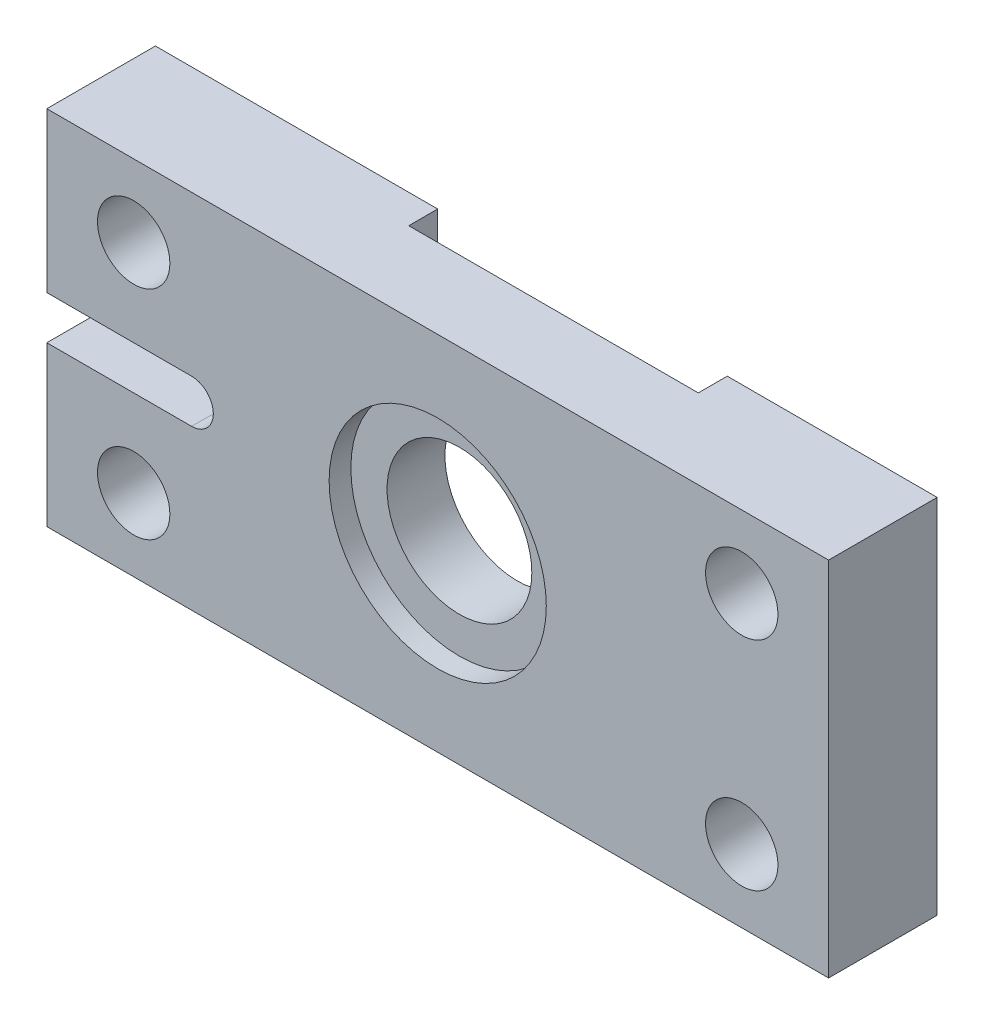
ISO-10303-21;
HEADER;
FILE_DESCRIPTION(('STEP AP214'),'2;1');
FILE_NAME('part.step','',(''),(''),'','','');
FILE_SCHEMA(('AUTOMOTIVE_DESIGN { 1 0 10303 214 1 1 1 1 }'));
ENDSEC;
DATA;
#1=APPLICATION_CONTEXT('core data for automotive mechanical design processes');
#2=APPLICATION_PROTOCOL_DEFINITION('international standard','automotive_design',2000,#1);
#3=PRODUCT_CONTEXT('',#1,'mechanical');
#4=PRODUCT('Part','Part','',(#3));
#5=PRODUCT_RELATED_PRODUCT_CATEGORY('part','',(#4));
#6=PRODUCT_DEFINITION_FORMATION('','',#4);
#7=PRODUCT_DEFINITION_CONTEXT('part definition',#1,'design');
#8=PRODUCT_DEFINITION('design','',#6,#7);
#9=PRODUCT_DEFINITION_SHAPE('','',#8);
#10=(LENGTH_UNIT() NAMED_UNIT(*) SI_UNIT(.MILLI.,.METRE.));
#11=(NAMED_UNIT(*) PLANE_ANGLE_UNIT() SI_UNIT($,.RADIAN.));
#12=(NAMED_UNIT(*) SI_UNIT($,.STERADIAN.) SOLID_ANGLE_UNIT());
#13=UNCERTAINTY_MEASURE_WITH_UNIT(LENGTH_MEASURE(1.E-05),#10,'distance_accuracy_value','');
#14=(GEOMETRIC_REPRESENTATION_CONTEXT(3) GLOBAL_UNCERTAINTY_ASSIGNED_CONTEXT((#13)) GLOBAL_UNIT_ASSIGNED_CONTEXT((#10,
#11,#12)) REPRESENTATION_CONTEXT('',''));
#15=CARTESIAN_POINT('',(0.,0.,0.));
#16=DIRECTION('',(0.,0.,1.));
#17=DIRECTION('',(1.,0.,0.));
#18=AXIS2_PLACEMENT_3D('',#15,#16,#17);
#19=CARTESIAN_POINT('',(0.,0.,0.));
#20=DIRECTION('',(0.,0.,1.));
#21=DIRECTION('',(1.,0.,0.));
#22=AXIS2_PLACEMENT_3D('',#19,#20,#21);
#23=PLANE('',#22);
#24=CARTESIAN_POINT('',(42.,15.,0.));
#25=DIRECTION('',(0.,0.,1.));
#26=DIRECTION('',(1.,0.,0.));
#27=AXIS2_PLACEMENT_3D('',#24,#25,#26);
#28=CIRCLE('',#27,5.);
#29=CARTESIAN_POINT('',(47.,15.,0.));
#30=VERTEX_POINT('',#29);
#31=EDGE_CURVE('E202',#30,#30,#28,.T.);
#32=ORIENTED_EDGE('',*,*,#31,.T.);
#33=EDGE_LOOP('',(#32));
#34=FACE_BOUND('',#33,.T.);
#35=CARTESIAN_POINT('',(42.,-15.,0.));
#36=DIRECTION('',(0.,0.,1.));
#37=DIRECTION('',(1.,0.,0.));
#38=AXIS2_PLACEMENT_3D('',#35,#36,#37);
#39=CIRCLE('',#38,5.);
#40=CARTESIAN_POINT('',(47.,-15.,0.));
#41=VERTEX_POINT('',#40);
#42=EDGE_CURVE('E193',#41,#41,#39,.T.);
#43=ORIENTED_EDGE('',*,*,#42,.T.);
#44=EDGE_LOOP('',(#43));
#45=FACE_BOUND('',#44,.T.);
#46=DIRECTION('',(1.,0.,0.));
#47=VECTOR('',#46,1.);
#48=CARTESIAN_POINT('',(-54.,-25.,0.));
#49=LINE('',#48,#47);
#50=CARTESIAN_POINT('',(25.,-25.,0.));
#51=VERTEX_POINT('',#50);
#52=CARTESIAN_POINT('',(54.,-25.,0.));
#53=VERTEX_POINT('',#52);
#54=EDGE_CURVE('E282',#51,#53,#49,.T.);
#55=ORIENTED_EDGE('',*,*,#54,.F.);
#56=DIRECTION('',(0.,-1.,0.));
#57=VECTOR('',#56,1.);
#58=CARTESIAN_POINT('',(25.,25.,0.));
#59=LINE('',#58,#57);
#60=CARTESIAN_POINT('',(25.,25.,0.));
#61=VERTEX_POINT('',#60);
#62=EDGE_CURVE('E169',#61,#51,#59,.T.);
#63=ORIENTED_EDGE('',*,*,#62,.F.);
#64=DIRECTION('',(-1.,0.,0.));
#65=VECTOR('',#64,1.);
#66=CARTESIAN_POINT('',(-54.,25.,0.));
#67=LINE('',#66,#65);
#68=CARTESIAN_POINT('',(54.,25.,0.));
#69=VERTEX_POINT('',#68);
#70=EDGE_CURVE('E156',#69,#61,#67,.T.);
#71=ORIENTED_EDGE('',*,*,#70,.F.);
#72=DIRECTION('',(0.,1.,0.));
#73=VECTOR('',#72,1.);
#74=CARTESIAN_POINT('',(54.,25.,0.));
#75=LINE('',#74,#73);
#76=EDGE_CURVE('E247',#53,#69,#75,.T.);
#77=ORIENTED_EDGE('',*,*,#76,.F.);
#78=EDGE_LOOP('',(#55,#63,#71,#77));
#79=FACE_BOUND('',#78,.T.);
#80=ADVANCED_FACE('F39',(#34,#45,#79),#23,.F.);
#81=CARTESIAN_POINT('',(0.,0.,15.));
#82=DIRECTION('',(0.,0.,-1.));
#83=DIRECTION('',(-1.,0.,0.));
#84=AXIS2_PLACEMENT_3D('',#81,#82,#83);
#85=CYLINDRICAL_SURFACE('',#84,10.);
#86=CARTESIAN_POINT('',(0.,0.,4.));
#87=DIRECTION('',(0.,0.,1.));
#88=DIRECTION('',(1.,0.,0.));
#89=AXIS2_PLACEMENT_3D('',#86,#87,#88);
#90=CIRCLE('',#89,10.);
#91=CARTESIAN_POINT('',(10.,0.,4.));
#92=VERTEX_POINT('',#91);
#93=EDGE_CURVE('E172',#92,#92,#90,.T.);
#94=ORIENTED_EDGE('',*,*,#93,.F.);
#95=EDGE_LOOP('',(#94));
#96=FACE_BOUND('',#95,.T.);
#97=CARTESIAN_POINT('',(0.,0.,12.));
#98=DIRECTION('',(0.,0.,1.));
#99=DIRECTION('',(1.,0.,0.));
#100=AXIS2_PLACEMENT_3D('',#97,#98,#99);
#101=CIRCLE('',#100,10.);
#102=CARTESIAN_POINT('',(10.,0.,12.));
#103=VERTEX_POINT('',#102);
#104=EDGE_CURVE('E43',#103,#103,#101,.T.);
#105=ORIENTED_EDGE('',*,*,#104,.T.);
#106=EDGE_LOOP('',(#105));
#107=FACE_BOUND('',#106,.T.);
#108=ADVANCED_FACE('F335',(#96,#107),#85,.F.);
#109=CARTESIAN_POINT('',(-54.,25.,15.));
#110=DIRECTION('',(1.,0.,0.));
#111=DIRECTION('',(0.,0.,-1.));
#112=AXIS2_PLACEMENT_3D('',#109,#110,#111);
#113=PLANE('',#112);
#114=DIRECTION('',(0.,0.,-1.));
#115=VECTOR('',#114,1.);
#116=CARTESIAN_POINT('',(-54.,3.,15.));
#117=LINE('',#116,#115);
#118=CARTESIAN_POINT('',(-54.,3.,15.));
#119=VERTEX_POINT('',#118);
#120=CARTESIAN_POINT('',(-54.,3.,0.));
#121=VERTEX_POINT('',#120);
#122=EDGE_CURVE('E241',#119,#121,#117,.T.);
#123=ORIENTED_EDGE('',*,*,#122,.F.);
#124=DIRECTION('',(0.,-1.,0.));
#125=VECTOR('',#124,1.);
#126=CARTESIAN_POINT('',(-54.,25.,15.));
#127=LINE('',#126,#125);
#128=CARTESIAN_POINT('',(-54.,25.,15.));
#129=VERTEX_POINT('',#128);
#130=EDGE_CURVE('E263',#129,#119,#127,.T.);
#131=ORIENTED_EDGE('',*,*,#130,.F.);
#132=DIRECTION('',(0.,0.,-1.));
#133=VECTOR('',#132,1.);
#134=CARTESIAN_POINT('',(-54.,25.,15.));
#135=LINE('',#134,#133);
#136=CARTESIAN_POINT('',(-54.,25.,0.));
#137=VERTEX_POINT('',#136);
#138=EDGE_CURVE('E49',#129,#137,#135,.T.);
#139=ORIENTED_EDGE('',*,*,#138,.T.);
#140=DIRECTION('',(0.,-1.,0.));
#141=VECTOR('',#140,1.);
#142=CARTESIAN_POINT('',(-54.,25.,0.));
#143=LINE('',#142,#141);
#144=EDGE_CURVE('E278',#137,#121,#143,.T.);
#145=ORIENTED_EDGE('',*,*,#144,.T.);
#146=EDGE_LOOP('',(#123,#131,#139,#145));
#147=FACE_BOUND('',#146,.T.);
#148=ADVANCED_FACE('F300',(#147),#113,.F.);
#149=DIRECTION('',(0.,0.,-1.));
#150=VECTOR('',#149,1.);
#151=CARTESIAN_POINT('',(-54.,-3.,15.));
#152=LINE('',#151,#150);
#153=CARTESIAN_POINT('',(-54.,-3.,15.));
#154=VERTEX_POINT('',#153);
#155=CARTESIAN_POINT('',(-54.,-3.,0.));
#156=VERTEX_POINT('',#155);
#157=EDGE_CURVE('E237',#154,#156,#152,.T.);
#158=ORIENTED_EDGE('',*,*,#157,.T.);
#159=CARTESIAN_POINT('',(-54.,-25.,0.));
#160=VERTEX_POINT('',#159);
#161=EDGE_CURVE('E277',#156,#160,#143,.T.);
#162=ORIENTED_EDGE('',*,*,#161,.T.);
#163=DIRECTION('',(0.,0.,-1.));
#164=VECTOR('',#163,1.);
#165=CARTESIAN_POINT('',(-54.,-25.,15.));
#166=LINE('',#165,#164);
#167=CARTESIAN_POINT('',(-54.,-25.,15.));
#168=VERTEX_POINT('',#167);
#169=EDGE_CURVE('E289',#168,#160,#166,.T.);
#170=ORIENTED_EDGE('',*,*,#169,.F.);
#171=EDGE_CURVE('E262',#154,#168,#127,.T.);
#172=ORIENTED_EDGE('',*,*,#171,.F.);
#173=EDGE_LOOP('',(#158,#162,#170,#172));
#174=FACE_BOUND('',#173,.T.);
#175=ADVANCED_FACE('F497',(#174),#113,.F.);
#176=CARTESIAN_POINT('',(54.,25.,15.));
#177=DIRECTION('',(-1.,0.,0.));
#178=DIRECTION('',(0.,0.,1.));
#179=AXIS2_PLACEMENT_3D('',#176,#177,#178);
#180=PLANE('',#179);
#181=ORIENTED_EDGE('',*,*,#76,.T.);
#182=DIRECTION('',(0.,0.,-1.));
#183=VECTOR('',#182,1.);
#184=CARTESIAN_POINT('',(54.,25.,15.));
#185=LINE('',#184,#183);
#186=CARTESIAN_POINT('',(54.,25.,15.));
#187=VERTEX_POINT('',#186);
#188=EDGE_CURVE('E11',#187,#69,#185,.T.);
#189=ORIENTED_EDGE('',*,*,#188,.F.);
#190=DIRECTION('',(0.,1.,0.));
#191=VECTOR('',#190,1.);
#192=CARTESIAN_POINT('',(54.,25.,15.));
#193=LINE('',#192,#191);
#194=CARTESIAN_POINT('',(54.,-25.,15.));
#195=VERTEX_POINT('',#194);
#196=EDGE_CURVE('E254',#195,#187,#193,.T.);
#197=ORIENTED_EDGE('',*,*,#196,.F.);
#198=DIRECTION('',(0.,0.,-1.));
#199=VECTOR('',#198,1.);
#200=CARTESIAN_POINT('',(54.,-25.,15.));
#201=LINE('',#200,#199);
#202=EDGE_CURVE('E270',#195,#53,#201,.T.);
#203=ORIENTED_EDGE('',*,*,#202,.T.);
#204=EDGE_LOOP('',(#181,#189,#197,#203));
#205=FACE_BOUND('',#204,.T.);
#206=ADVANCED_FACE('F41',(#205),#180,.F.);
#207=CARTESIAN_POINT('',(-54.,25.,15.));
#208=DIRECTION('',(0.,-1.,0.));
#209=DIRECTION('',(1.,0.,0.));
#210=AXIS2_PLACEMENT_3D('',#207,#208,#209);
#211=PLANE('',#210);
#212=ORIENTED_EDGE('',*,*,#70,.T.);
#213=DIRECTION('',(0.,0.,1.));
#214=VECTOR('',#213,1.);
#215=CARTESIAN_POINT('',(25.,25.,4.));
#216=LINE('',#215,#214);
#217=CARTESIAN_POINT('',(25.,25.,4.));
#218=VERTEX_POINT('',#217);
#219=EDGE_CURVE('E135',#61,#218,#216,.T.);
#220=ORIENTED_EDGE('',*,*,#219,.T.);
#221=DIRECTION('',(-1.,0.,0.));
#222=VECTOR('',#221,1.);
#223=CARTESIAN_POINT('',(-15.,25.,4.));
#224=LINE('',#223,#222);
#225=CARTESIAN_POINT('',(-15.,25.,4.));
#226=VERTEX_POINT('',#225);
#227=EDGE_CURVE('E147',#218,#226,#224,.T.);
#228=ORIENTED_EDGE('',*,*,#227,.T.);
#229=DIRECTION('',(0.,0.,-1.));
#230=VECTOR('',#229,1.);
#231=CARTESIAN_POINT('',(-15.,25.,0.));
#232=LINE('',#231,#230);
#233=CARTESIAN_POINT('',(-15.,25.,0.));
#234=VERTEX_POINT('',#233);
#235=EDGE_CURVE('E144',#226,#234,#232,.T.);
#236=ORIENTED_EDGE('',*,*,#235,.T.);
#237=EDGE_CURVE('E274',#234,#137,#67,.T.);
#238=ORIENTED_EDGE('',*,*,#237,.T.);
#239=ORIENTED_EDGE('',*,*,#138,.F.);
#240=DIRECTION('',(-1.,0.,0.));
#241=VECTOR('',#240,1.);
#242=CARTESIAN_POINT('',(-54.,25.,15.));
#243=LINE('',#242,#241);
#244=EDGE_CURVE('E258',#187,#129,#243,.T.);
#245=ORIENTED_EDGE('',*,*,#244,.F.);
#246=ORIENTED_EDGE('',*,*,#188,.T.);
#247=EDGE_LOOP('',(#212,#220,#228,#236,#238,#239,#245,#246));
#248=FACE_BOUND('',#247,.T.);
#249=ADVANCED_FACE('F155',(#248),#211,.F.);
#250=CARTESIAN_POINT('',(-54.,-25.,15.));
#251=DIRECTION('',(0.,1.,0.));
#252=DIRECTION('',(0.,0.,1.));
#253=AXIS2_PLACEMENT_3D('',#250,#251,#252);
#254=PLANE('',#253);
#255=DIRECTION('',(-1.,0.,0.));
#256=VECTOR('',#255,1.);
#257=CARTESIAN_POINT('',(-15.,-25.,4.));
#258=LINE('',#257,#256);
#259=CARTESIAN_POINT('',(25.,-25.,4.));
#260=VERTEX_POINT('',#259);
#261=CARTESIAN_POINT('',(-15.,-25.,4.));
#262=VERTEX_POINT('',#261);
#263=EDGE_CURVE('E160',#260,#262,#258,.T.);
#264=ORIENTED_EDGE('',*,*,#263,.F.);
#265=DIRECTION('',(0.,0.,1.));
#266=VECTOR('',#265,1.);
#267=CARTESIAN_POINT('',(25.,-25.,4.));
#268=LINE('',#267,#266);
#269=EDGE_CURVE('E138',#51,#260,#268,.T.);
#270=ORIENTED_EDGE('',*,*,#269,.F.);
#271=ORIENTED_EDGE('',*,*,#54,.T.);
#272=ORIENTED_EDGE('',*,*,#202,.F.);
#273=DIRECTION('',(1.,0.,0.));
#274=VECTOR('',#273,1.);
#275=CARTESIAN_POINT('',(-54.,-25.,15.));
#276=LINE('',#275,#274);
#277=EDGE_CURVE('E267',#168,#195,#276,.T.);
#278=ORIENTED_EDGE('',*,*,#277,.F.);
#279=ORIENTED_EDGE('',*,*,#169,.T.);
#280=CARTESIAN_POINT('',(-15.,-25.,0.));
#281=VERTEX_POINT('',#280);
#282=EDGE_CURVE('E259',#160,#281,#49,.T.);
#283=ORIENTED_EDGE('',*,*,#282,.T.);
#284=DIRECTION('',(0.,0.,-1.));
#285=VECTOR('',#284,1.);
#286=CARTESIAN_POINT('',(-15.,-25.,0.));
#287=LINE('',#286,#285);
#288=EDGE_CURVE('E56',#262,#281,#287,.T.);
#289=ORIENTED_EDGE('',*,*,#288,.F.);
#290=EDGE_LOOP('',(#264,#270,#271,#272,#278,#279,#283,#289));
#291=FACE_BOUND('',#290,.T.);
#292=ADVANCED_FACE('F323',(#291),#254,.F.);
#293=CARTESIAN_POINT('',(0.,0.,15.));
#294=DIRECTION('',(0.,0.,1.));
#295=DIRECTION('',(1.,0.,0.));
#296=AXIS2_PLACEMENT_3D('',#293,#294,#295);
#297=PLANE('',#296);
#298=CARTESIAN_POINT('',(0.,0.,15.));
#299=DIRECTION('',(0.,0.,1.));
#300=DIRECTION('',(1.,0.,0.));
#301=AXIS2_PLACEMENT_3D('',#298,#299,#300);
#302=CIRCLE('',#301,15.);
#303=CARTESIAN_POINT('',(15.,0.,15.));
#304=VERTEX_POINT('',#303);
#305=EDGE_CURVE('E181',#304,#304,#302,.T.);
#306=ORIENTED_EDGE('',*,*,#305,.F.);
#307=EDGE_LOOP('',(#306));
#308=FACE_BOUND('',#307,.T.);
#309=CARTESIAN_POINT('',(42.,-15.,15.));
#310=DIRECTION('',(0.,0.,1.));
#311=DIRECTION('',(1.,0.,0.));
#312=AXIS2_PLACEMENT_3D('',#309,#310,#311);
#313=CIRCLE('',#312,5.);
#314=CARTESIAN_POINT('',(47.,-15.,15.));
#315=VERTEX_POINT('',#314);
#316=EDGE_CURVE('E207',#315,#315,#313,.T.);
#317=ORIENTED_EDGE('',*,*,#316,.F.);
#318=EDGE_LOOP('',(#317));
#319=FACE_BOUND('',#318,.T.);
#320=CARTESIAN_POINT('',(-42.,15.,15.));
#321=DIRECTION('',(0.,0.,1.));
#322=DIRECTION('',(1.,0.,0.));
#323=AXIS2_PLACEMENT_3D('',#320,#321,#322);
#324=CIRCLE('',#323,5.00000000000001);
#325=CARTESIAN_POINT('',(-37.,15.,15.));
#326=VERTEX_POINT('',#325);
#327=EDGE_CURVE('E198',#326,#326,#324,.T.);
#328=ORIENTED_EDGE('',*,*,#327,.F.);
#329=EDGE_LOOP('',(#328));
#330=FACE_BOUND('',#329,.T.);
#331=CARTESIAN_POINT('',(42.,15.,15.));
#332=DIRECTION('',(0.,0.,1.));
#333=DIRECTION('',(1.,0.,0.));
#334=AXIS2_PLACEMENT_3D('',#331,#332,#333);
#335=CIRCLE('',#334,5.);
#336=CARTESIAN_POINT('',(47.,15.,15.));
#337=VERTEX_POINT('',#336);
#338=EDGE_CURVE('E228',#337,#337,#335,.T.);
#339=ORIENTED_EDGE('',*,*,#338,.F.);
#340=EDGE_LOOP('',(#339));
#341=FACE_BOUND('',#340,.T.);
#342=CARTESIAN_POINT('',(-42.,-15.,15.));
#343=DIRECTION('',(0.,0.,1.));
#344=DIRECTION('',(1.,0.,0.));
#345=AXIS2_PLACEMENT_3D('',#342,#343,#344);
#346=CIRCLE('',#345,5.00000000000001);
#347=CARTESIAN_POINT('',(-37.,-15.,15.));
#348=VERTEX_POINT('',#347);
#349=EDGE_CURVE('E189',#348,#348,#346,.T.);
#350=ORIENTED_EDGE('',*,*,#349,.F.);
#351=EDGE_LOOP('',(#350));
#352=FACE_BOUND('',#351,.T.);
#353=ORIENTED_EDGE('',*,*,#130,.T.);
#354=DIRECTION('',(-1.,0.,0.));
#355=VECTOR('',#354,1.);
#356=CARTESIAN_POINT('',(-34.,3.,15.));
#357=LINE('',#356,#355);
#358=CARTESIAN_POINT('',(-34.,3.,15.));
#359=VERTEX_POINT('',#358);
#360=EDGE_CURVE('E217',#359,#119,#357,.T.);
#361=ORIENTED_EDGE('',*,*,#360,.F.);
#362=CARTESIAN_POINT('',(-34.,0.,15.));
#363=DIRECTION('',(0.,0.,1.));
#364=DIRECTION('',(1.,0.,0.));
#365=AXIS2_PLACEMENT_3D('',#362,#363,#364);
#366=CIRCLE('',#365,3.);
#367=CARTESIAN_POINT('',(-34.,-3.,15.));
#368=VERTEX_POINT('',#367);
#369=EDGE_CURVE('E214',#368,#359,#366,.T.);
#370=ORIENTED_EDGE('',*,*,#369,.F.);
#371=DIRECTION('',(1.,0.,0.));
#372=VECTOR('',#371,1.);
#373=CARTESIAN_POINT('',(-34.,-3.,15.));
#374=LINE('',#373,#372);
#375=EDGE_CURVE('E221',#154,#368,#374,.T.);
#376=ORIENTED_EDGE('',*,*,#375,.F.);
#377=ORIENTED_EDGE('',*,*,#171,.T.);
#378=ORIENTED_EDGE('',*,*,#277,.T.);
#379=ORIENTED_EDGE('',*,*,#196,.T.);
#380=ORIENTED_EDGE('',*,*,#244,.T.);
#381=EDGE_LOOP('',(#353,#361,#370,#376,#377,#378,#379,#380));
#382=FACE_BOUND('',#381,.T.);
#383=ADVANCED_FACE('F313',(#308,#319,#330,#341,#352,#382),#297,.T.);
#384=CARTESIAN_POINT('',(-42.,15.,0.));
#385=DIRECTION('',(0.,0.,1.));
#386=DIRECTION('',(1.,0.,0.));
#387=AXIS2_PLACEMENT_3D('',#384,#385,#386);
#388=CIRCLE('',#387,5.00000000000001);
#389=CARTESIAN_POINT('',(-37.,15.,0.));
#390=VERTEX_POINT('',#389);
#391=EDGE_CURVE('E203',#390,#390,#388,.T.);
#392=ORIENTED_EDGE('',*,*,#391,.T.);
#393=EDGE_LOOP('',(#392));
#394=FACE_BOUND('',#393,.T.);
#395=ORIENTED_EDGE('',*,*,#237,.F.);
#396=DIRECTION('',(0.,-1.,0.));
#397=VECTOR('',#396,1.);
#398=CARTESIAN_POINT('',(-15.,25.,0.));
#399=LINE('',#398,#397);
#400=EDGE_CURVE('E173',#234,#281,#399,.T.);
#401=ORIENTED_EDGE('',*,*,#400,.T.);
#402=ORIENTED_EDGE('',*,*,#282,.F.);
#403=ORIENTED_EDGE('',*,*,#161,.F.);
#404=DIRECTION('',(1.,0.,0.));
#405=VECTOR('',#404,1.);
#406=CARTESIAN_POINT('',(-34.,-3.,0.));
#407=LINE('',#406,#405);
#408=CARTESIAN_POINT('',(-34.,-3.,0.));
#409=VERTEX_POINT('',#408);
#410=EDGE_CURVE('E218',#156,#409,#407,.T.);
#411=ORIENTED_EDGE('',*,*,#410,.T.);
#412=CARTESIAN_POINT('',(-34.,0.,0.));
#413=DIRECTION('',(0.,0.,1.));
#414=DIRECTION('',(1.,0.,0.));
#415=AXIS2_PLACEMENT_3D('',#412,#413,#414);
#416=CIRCLE('',#415,3.);
#417=CARTESIAN_POINT('',(-34.,3.,0.));
#418=VERTEX_POINT('',#417);
#419=EDGE_CURVE('E64',#409,#418,#416,.T.);
#420=ORIENTED_EDGE('',*,*,#419,.T.);
#421=DIRECTION('',(-1.,0.,0.));
#422=VECTOR('',#421,1.);
#423=CARTESIAN_POINT('',(-34.,3.,0.));
#424=LINE('',#423,#422);
#425=EDGE_CURVE('E227',#418,#121,#424,.T.);
#426=ORIENTED_EDGE('',*,*,#425,.T.);
#427=ORIENTED_EDGE('',*,*,#144,.F.);
#428=EDGE_LOOP('',(#395,#401,#402,#403,#411,#420,#426,#427));
#429=FACE_BOUND('',#428,.T.);
#430=CARTESIAN_POINT('',(-42.,-15.,0.));
#431=DIRECTION('',(0.,0.,1.));
#432=DIRECTION('',(1.,0.,0.));
#433=AXIS2_PLACEMENT_3D('',#430,#431,#432);
#434=CIRCLE('',#433,5.00000000000001);
#435=CARTESIAN_POINT('',(-37.,-15.,0.));
#436=VERTEX_POINT('',#435);
#437=EDGE_CURVE('E194',#436,#436,#434,.T.);
#438=ORIENTED_EDGE('',*,*,#437,.T.);
#439=EDGE_LOOP('',(#438));
#440=FACE_BOUND('',#439,.T.);
#441=ADVANCED_FACE('F303',(#394,#429,#440),#23,.F.);
#442=CARTESIAN_POINT('',(-42.,-15.,15.));
#443=DIRECTION('',(0.,0.,-1.));
#444=DIRECTION('',(-1.,0.,0.));
#445=AXIS2_PLACEMENT_3D('',#442,#443,#444);
#446=CYLINDRICAL_SURFACE('',#445,5.00000000000001);
#447=ORIENTED_EDGE('',*,*,#349,.T.);
#448=EDGE_LOOP('',(#447));
#449=FACE_BOUND('',#448,.T.);
#450=ORIENTED_EDGE('',*,*,#437,.F.);
#451=EDGE_LOOP('',(#450));
#452=FACE_BOUND('',#451,.T.);
#453=ADVANCED_FACE('F361',(#449,#452),#446,.F.);
#454=CARTESIAN_POINT('',(-34.,0.,15.));
#455=DIRECTION('',(0.,0.,-1.));
#456=DIRECTION('',(-1.,0.,0.));
#457=AXIS2_PLACEMENT_3D('',#454,#455,#456);
#458=CYLINDRICAL_SURFACE('',#457,3.);
#459=ORIENTED_EDGE('',*,*,#419,.F.);
#460=DIRECTION('',(0.,0.,-1.));
#461=VECTOR('',#460,1.);
#462=CARTESIAN_POINT('',(-34.,-3.,15.));
#463=LINE('',#462,#461);
#464=EDGE_CURVE('E224',#368,#409,#463,.T.);
#465=ORIENTED_EDGE('',*,*,#464,.F.);
#466=ORIENTED_EDGE('',*,*,#369,.T.);
#467=DIRECTION('',(0.,0.,-1.));
#468=VECTOR('',#467,1.);
#469=CARTESIAN_POINT('',(-34.,3.,15.));
#470=LINE('',#469,#468);
#471=EDGE_CURVE('E244',#359,#418,#470,.T.);
#472=ORIENTED_EDGE('',*,*,#471,.T.);
#473=EDGE_LOOP('',(#459,#465,#466,#472));
#474=FACE_BOUND('',#473,.T.);
#475=ADVANCED_FACE('F309',(#474),#458,.F.);
#476=CARTESIAN_POINT('',(-34.,3.,15.));
#477=DIRECTION('',(0.,-1.,0.));
#478=DIRECTION('',(1.,0.,0.));
#479=AXIS2_PLACEMENT_3D('',#476,#477,#478);
#480=PLANE('',#479);
#481=ORIENTED_EDGE('',*,*,#425,.F.);
#482=ORIENTED_EDGE('',*,*,#471,.F.);
#483=ORIENTED_EDGE('',*,*,#360,.T.);
#484=ORIENTED_EDGE('',*,*,#122,.T.);
#485=EDGE_LOOP('',(#481,#482,#483,#484));
#486=FACE_BOUND('',#485,.T.);
#487=ADVANCED_FACE('F307',(#486),#480,.T.);
#488=CARTESIAN_POINT('',(-34.,-3.,15.));
#489=DIRECTION('',(0.,1.,0.));
#490=DIRECTION('',(-1.,0.,0.));
#491=AXIS2_PLACEMENT_3D('',#488,#489,#490);
#492=PLANE('',#491);
#493=ORIENTED_EDGE('',*,*,#410,.F.);
#494=ORIENTED_EDGE('',*,*,#157,.F.);
#495=ORIENTED_EDGE('',*,*,#375,.T.);
#496=ORIENTED_EDGE('',*,*,#464,.T.);
#497=EDGE_LOOP('',(#493,#494,#495,#496));
#498=FACE_BOUND('',#497,.T.);
#499=ADVANCED_FACE('F394',(#498),#492,.T.);
#500=CARTESIAN_POINT('',(42.,15.,15.));
#501=DIRECTION('',(0.,0.,-1.));
#502=DIRECTION('',(-1.,0.,0.));
#503=AXIS2_PLACEMENT_3D('',#500,#501,#502);
#504=CYLINDRICAL_SURFACE('',#503,5.);
#505=ORIENTED_EDGE('',*,*,#338,.T.);
#506=EDGE_LOOP('',(#505));
#507=FACE_BOUND('',#506,.T.);
#508=ORIENTED_EDGE('',*,*,#31,.F.);
#509=EDGE_LOOP('',(#508));
#510=FACE_BOUND('',#509,.T.);
#511=ADVANCED_FACE('F390',(#507,#510),#504,.F.);
#512=CARTESIAN_POINT('',(-42.,15.,15.));
#513=DIRECTION('',(0.,0.,-1.));
#514=DIRECTION('',(-1.,0.,0.));
#515=AXIS2_PLACEMENT_3D('',#512,#513,#514);
#516=CYLINDRICAL_SURFACE('',#515,5.00000000000001);
#517=ORIENTED_EDGE('',*,*,#327,.T.);
#518=EDGE_LOOP('',(#517));
#519=FACE_BOUND('',#518,.T.);
#520=ORIENTED_EDGE('',*,*,#391,.F.);
#521=EDGE_LOOP('',(#520));
#522=FACE_BOUND('',#521,.T.);
#523=ADVANCED_FACE('F384',(#519,#522),#516,.F.);
#524=CARTESIAN_POINT('',(42.,-15.,15.));
#525=DIRECTION('',(0.,0.,-1.));
#526=DIRECTION('',(-1.,0.,0.));
#527=AXIS2_PLACEMENT_3D('',#524,#525,#526);
#528=CYLINDRICAL_SURFACE('',#527,5.);
#529=ORIENTED_EDGE('',*,*,#316,.T.);
#530=EDGE_LOOP('',(#529));
#531=FACE_BOUND('',#530,.T.);
#532=ORIENTED_EDGE('',*,*,#42,.F.);
#533=EDGE_LOOP('',(#532));
#534=FACE_BOUND('',#533,.T.);
#535=ADVANCED_FACE('F346',(#531,#534),#528,.F.);
#536=CARTESIAN_POINT('',(0.,0.,12.));
#537=DIRECTION('',(0.,0.,1.));
#538=DIRECTION('',(1.,0.,0.));
#539=AXIS2_PLACEMENT_3D('',#536,#537,#538);
#540=CYLINDRICAL_SURFACE('',#539,15.);
#541=CARTESIAN_POINT('',(0.,0.,12.));
#542=DIRECTION('',(0.,0.,1.));
#543=DIRECTION('',(1.,0.,0.));
#544=AXIS2_PLACEMENT_3D('',#541,#542,#543);
#545=CIRCLE('',#544,15.);
#546=CARTESIAN_POINT('',(15.,0.,12.));
#547=VERTEX_POINT('',#546);
#548=EDGE_CURVE('E182',#547,#547,#545,.T.);
#549=ORIENTED_EDGE('',*,*,#548,.F.);
#550=EDGE_LOOP('',(#549));
#551=FACE_BOUND('',#550,.T.);
#552=ORIENTED_EDGE('',*,*,#305,.T.);
#553=EDGE_LOOP('',(#552));
#554=FACE_BOUND('',#553,.T.);
#555=ADVANCED_FACE('F340',(#551,#554),#540,.F.);
#556=CARTESIAN_POINT('',(0.,0.,12.));
#557=DIRECTION('',(0.,0.,1.));
#558=DIRECTION('',(1.,0.,0.));
#559=AXIS2_PLACEMENT_3D('',#556,#557,#558);
#560=PLANE('',#559);
#561=ORIENTED_EDGE('',*,*,#104,.F.);
#562=EDGE_LOOP('',(#561));
#563=FACE_BOUND('',#562,.T.);
#564=ORIENTED_EDGE('',*,*,#548,.T.);
#565=EDGE_LOOP('',(#564));
#566=FACE_BOUND('',#565,.T.);
#567=ADVANCED_FACE('F337',(#563,#566),#560,.T.);
#568=CARTESIAN_POINT('',(25.,25.,4.));
#569=DIRECTION('',(1.,0.,0.));
#570=DIRECTION('',(0.,0.,-1.));
#571=AXIS2_PLACEMENT_3D('',#568,#569,#570);
#572=PLANE('',#571);
#573=ORIENTED_EDGE('',*,*,#269,.T.);
#574=DIRECTION('',(0.,-1.,0.));
#575=VECTOR('',#574,1.);
#576=CARTESIAN_POINT('',(25.,25.,4.));
#577=LINE('',#576,#575);
#578=EDGE_CURVE('E131',#218,#260,#577,.T.);
#579=ORIENTED_EDGE('',*,*,#578,.F.);
#580=ORIENTED_EDGE('',*,*,#219,.F.);
#581=ORIENTED_EDGE('',*,*,#62,.T.);
#582=EDGE_LOOP('',(#573,#579,#580,#581));
#583=FACE_BOUND('',#582,.T.);
#584=ADVANCED_FACE('F133',(#583),#572,.F.);
#585=CARTESIAN_POINT('',(-15.,25.,0.));
#586=DIRECTION('',(-1.,0.,0.));
#587=DIRECTION('',(0.,0.,1.));
#588=AXIS2_PLACEMENT_3D('',#585,#586,#587);
#589=PLANE('',#588);
#590=ORIENTED_EDGE('',*,*,#288,.T.);
#591=ORIENTED_EDGE('',*,*,#400,.F.);
#592=ORIENTED_EDGE('',*,*,#235,.F.);
#593=DIRECTION('',(0.,-1.,0.));
#594=VECTOR('',#593,1.);
#595=CARTESIAN_POINT('',(-15.,25.,4.));
#596=LINE('',#595,#594);
#597=EDGE_CURVE('E143',#226,#262,#596,.T.);
#598=ORIENTED_EDGE('',*,*,#597,.T.);
#599=EDGE_LOOP('',(#590,#591,#592,#598));
#600=FACE_BOUND('',#599,.T.);
#601=ADVANCED_FACE('F328',(#600),#589,.F.);
#602=CARTESIAN_POINT('',(-15.,25.,4.));
#603=DIRECTION('',(0.,0.,1.));
#604=DIRECTION('',(1.,0.,0.));
#605=AXIS2_PLACEMENT_3D('',#602,#603,#604);
#606=PLANE('',#605);
#607=ORIENTED_EDGE('',*,*,#93,.T.);
#608=EDGE_LOOP('',(#607));
#609=FACE_BOUND('',#608,.T.);
#610=ORIENTED_EDGE('',*,*,#263,.T.);
#611=ORIENTED_EDGE('',*,*,#597,.F.);
#612=ORIENTED_EDGE('',*,*,#227,.F.);
#613=ORIENTED_EDGE('',*,*,#578,.T.);
#614=EDGE_LOOP('',(#610,#611,#612,#613));
#615=FACE_BOUND('',#614,.T.);
#616=ADVANCED_FACE('F148',(#609,#615),#606,.F.);
#617=CLOSED_SHELL('',(#80,#108,#148,#175,#206,#249,#292,#383,#441,#453,#475,#487,#499,#511,#523,
#535,#555,#567,#584,#601,#616));
#618=MANIFOLD_SOLID_BREP('B2',#617);
#619=ADVANCED_BREP_SHAPE_REPRESENTATION('',(#18,#618),#14);
#620=SHAPE_DEFINITION_REPRESENTATION(#9,#619);
ENDSEC;
END-ISO-10303-21;
